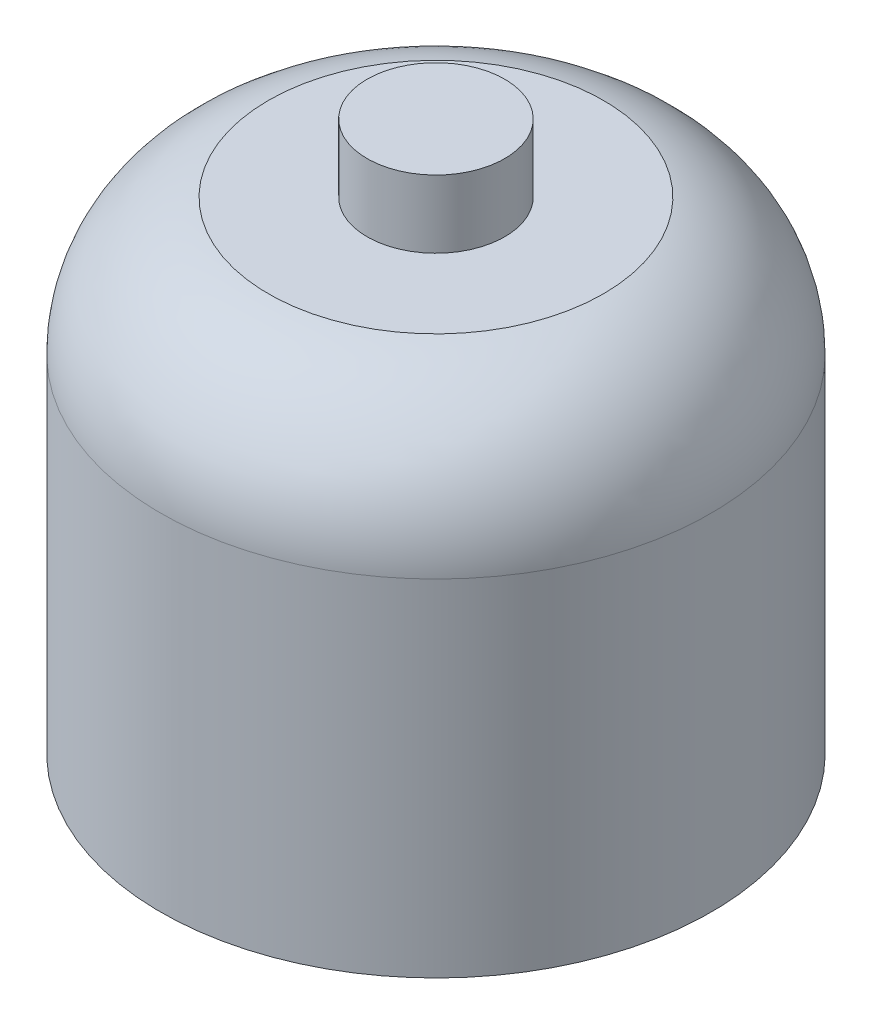
ISO-10303-21;
HEADER;
FILE_DESCRIPTION(('STEP AP214'),'2;1');
FILE_NAME('part.step','',(''),(''),'','','');
FILE_SCHEMA(('AUTOMOTIVE_DESIGN { 1 0 10303 214 1 1 1 1 }'));
ENDSEC;
DATA;
#1=APPLICATION_CONTEXT('core data for automotive mechanical design processes');
#2=APPLICATION_PROTOCOL_DEFINITION('international standard','automotive_design',2000,#1);
#3=PRODUCT_CONTEXT('',#1,'mechanical');
#4=PRODUCT('Part','Part','',(#3));
#5=PRODUCT_RELATED_PRODUCT_CATEGORY('part','',(#4));
#6=PRODUCT_DEFINITION_FORMATION('','',#4);
#7=PRODUCT_DEFINITION_CONTEXT('part definition',#1,'design');
#8=PRODUCT_DEFINITION('design','',#6,#7);
#9=PRODUCT_DEFINITION_SHAPE('','',#8);
#10=(LENGTH_UNIT() NAMED_UNIT(*) SI_UNIT(.MILLI.,.METRE.));
#11=(NAMED_UNIT(*) PLANE_ANGLE_UNIT() SI_UNIT($,.RADIAN.));
#12=(NAMED_UNIT(*) SI_UNIT($,.STERADIAN.) SOLID_ANGLE_UNIT());
#13=UNCERTAINTY_MEASURE_WITH_UNIT(LENGTH_MEASURE(1.E-05),#10,'distance_accuracy_value','');
#14=(GEOMETRIC_REPRESENTATION_CONTEXT(3) GLOBAL_UNCERTAINTY_ASSIGNED_CONTEXT((#13)) GLOBAL_UNIT_ASSIGNED_CONTEXT((#10,
#11,#12)) REPRESENTATION_CONTEXT('',''));
#15=CARTESIAN_POINT('',(0.,0.,0.));
#16=DIRECTION('',(0.,0.,1.));
#17=DIRECTION('',(1.,0.,0.));
#18=AXIS2_PLACEMENT_3D('',#15,#16,#17);
#19=CARTESIAN_POINT('',(-100.,364.980544747082,0.));
#20=DIRECTION('',(0.,1.,0.));
#21=DIRECTION('',(-1.,0.,0.));
#22=AXIS2_PLACEMENT_3D('',#19,#20,#21);
#23=PLANE('',#22);
#24=CARTESIAN_POINT('',(0.,364.980544747082,0.));
#25=DIRECTION('',(0.,1.,0.));
#26=DIRECTION('',(-1.,0.,0.));
#27=AXIS2_PLACEMENT_3D('',#24,#25,#26);
#28=CIRCLE('',#27,100.);
#29=CARTESIAN_POINT('',(-100.,364.980544747082,0.));
#30=VERTEX_POINT('',#29);
#31=EDGE_CURVE('E51',#30,#30,#28,.T.);
#32=ORIENTED_EDGE('',*,*,#31,.T.);
#33=EDGE_LOOP('',(#32));
#34=FACE_BOUND('',#33,.T.);
#35=ADVANCED_FACE('F32',(#34),#23,.T.);
#36=CARTESIAN_POINT('',(0.,-433.463035019455,0.));
#37=DIRECTION('',(0.,-1.,0.));
#38=DIRECTION('',(1.,0.,0.));
#39=AXIS2_PLACEMENT_3D('',#36,#37,#38);
#40=PLANE('',#39);
#41=CARTESIAN_POINT('',(0.,-433.463035019455,0.));
#42=DIRECTION('',(0.,-1.,0.));
#43=DIRECTION('',(1.,0.,0.));
#44=AXIS2_PLACEMENT_3D('',#41,#42,#43);
#45=CIRCLE('',#44,300.);
#46=CARTESIAN_POINT('',(300.,-433.463035019455,0.));
#47=VERTEX_POINT('',#46);
#48=EDGE_CURVE('E55',#47,#47,#45,.T.);
#49=ORIENTED_EDGE('',*,*,#48,.F.);
#50=EDGE_LOOP('',(#49));
#51=FACE_BOUND('',#50,.T.);
#52=CARTESIAN_POINT('',(0.,-433.463035019455,0.));
#53=DIRECTION('',(0.,1.,0.));
#54=DIRECTION('',(-1.,0.,0.));
#55=AXIS2_PLACEMENT_3D('',#52,#53,#54);
#56=CIRCLE('',#55,400.);
#57=CARTESIAN_POINT('',(-400.,-433.463035019455,0.));
#58=VERTEX_POINT('',#57);
#59=EDGE_CURVE('E10',#58,#58,#56,.T.);
#60=ORIENTED_EDGE('',*,*,#59,.F.);
#61=EDGE_LOOP('',(#60));
#62=FACE_BOUND('',#61,.T.);
#63=ADVANCED_FACE('F70',(#51,#62),#40,.T.);
#64=CARTESIAN_POINT('',(0.,266.536964980545,0.));
#65=DIRECTION('',(0.,1.,0.));
#66=DIRECTION('',(-1.,0.,0.));
#67=AXIS2_PLACEMENT_3D('',#64,#65,#66);
#68=CYLINDRICAL_SURFACE('',#67,400.);
#69=ORIENTED_EDGE('',*,*,#59,.T.);
#70=EDGE_LOOP('',(#69));
#71=FACE_BOUND('',#70,.T.);
#72=CARTESIAN_POINT('',(0.,68.6249777097032,0.));
#73=DIRECTION('',(0.,1.,0.));
#74=DIRECTION('',(-1.,0.,0.));
#75=AXIS2_PLACEMENT_3D('',#72,#73,#74);
#76=CIRCLE('',#75,400.);
#77=CARTESIAN_POINT('',(-400.,68.6249777097032,0.));
#78=VERTEX_POINT('',#77);
#79=EDGE_CURVE('E38',#78,#78,#76,.T.);
#80=ORIENTED_EDGE('',*,*,#79,.F.);
#81=EDGE_LOOP('',(#80));
#82=FACE_BOUND('',#81,.T.);
#83=ADVANCED_FACE('F73',(#71,#82),#68,.T.);
#84=CARTESIAN_POINT('',(0.,68.6249777097032,0.));
#85=DIRECTION('',(0.,1.,0.));
#86=DIRECTION('',(-1.,0.,0.));
#87=AXIS2_PLACEMENT_3D('',#84,#85,#86);
#88=DEGENERATE_TOROIDAL_SURFACE('',#87,196.611046082,203.388953918,.T.);
#89=ORIENTED_EDGE('',*,*,#79,.T.);
#90=EDGE_LOOP('',(#89));
#91=FACE_BOUND('',#90,.T.);
#92=CARTESIAN_POINT('',(0.,266.536964980545,0.));
#93=DIRECTION('',(0.,1.,0.));
#94=DIRECTION('',(-1.,0.,0.));
#95=AXIS2_PLACEMENT_3D('',#92,#93,#94);
#96=CIRCLE('',#95,243.492938859113);
#97=CARTESIAN_POINT('',(-243.492938859113,266.536964980545,0.));
#98=VERTEX_POINT('',#97);
#99=EDGE_CURVE('E42',#98,#98,#96,.T.);
#100=ORIENTED_EDGE('',*,*,#99,.F.);
#101=EDGE_LOOP('',(#100));
#102=FACE_BOUND('',#101,.T.);
#103=ADVANCED_FACE('F78',(#91,#102),#88,.T.);
#104=CARTESIAN_POINT('',(-243.492938859113,266.536964980545,0.));
#105=DIRECTION('',(0.,1.,0.));
#106=DIRECTION('',(-1.,0.,0.));
#107=AXIS2_PLACEMENT_3D('',#104,#105,#106);
#108=PLANE('',#107);
#109=ORIENTED_EDGE('',*,*,#99,.T.);
#110=EDGE_LOOP('',(#109));
#111=FACE_BOUND('',#110,.T.);
#112=CARTESIAN_POINT('',(0.,266.536964980545,0.));
#113=DIRECTION('',(0.,1.,0.));
#114=DIRECTION('',(-1.,0.,0.));
#115=AXIS2_PLACEMENT_3D('',#112,#113,#114);
#116=CIRCLE('',#115,100.);
#117=CARTESIAN_POINT('',(-100.,266.536964980545,0.));
#118=VERTEX_POINT('',#117);
#119=EDGE_CURVE('E46',#118,#118,#116,.T.);
#120=ORIENTED_EDGE('',*,*,#119,.F.);
#121=EDGE_LOOP('',(#120));
#122=FACE_BOUND('',#121,.T.);
#123=ADVANCED_FACE('F84',(#111,#122),#108,.T.);
#124=CARTESIAN_POINT('',(0.,266.536964980545,0.));
#125=DIRECTION('',(0.,1.,0.));
#126=DIRECTION('',(-1.,0.,0.));
#127=AXIS2_PLACEMENT_3D('',#124,#125,#126);
#128=CYLINDRICAL_SURFACE('',#127,100.);
#129=ORIENTED_EDGE('',*,*,#119,.T.);
#130=EDGE_LOOP('',(#129));
#131=FACE_BOUND('',#130,.T.);
#132=ORIENTED_EDGE('',*,*,#31,.F.);
#133=EDGE_LOOP('',(#132));
#134=FACE_BOUND('',#133,.T.);
#135=ADVANCED_FACE('F66',(#131,#134),#128,.T.);
#136=CARTESIAN_POINT('',(0.,-33.4630350194554,0.));
#137=DIRECTION('',(0.,-1.,0.));
#138=DIRECTION('',(1.,0.,0.));
#139=AXIS2_PLACEMENT_3D('',#136,#137,#138);
#140=CYLINDRICAL_SURFACE('',#139,300.);
#141=CARTESIAN_POINT('',(0.,-33.4630350194554,0.));
#142=DIRECTION('',(0.,-1.,0.));
#143=DIRECTION('',(1.,0.,0.));
#144=AXIS2_PLACEMENT_3D('',#141,#142,#143);
#145=CIRCLE('',#144,300.);
#146=CARTESIAN_POINT('',(300.,-33.4630350194553,0.));
#147=VERTEX_POINT('',#146);
#148=EDGE_CURVE('E54',#147,#147,#145,.T.);
#149=ORIENTED_EDGE('',*,*,#148,.F.);
#150=EDGE_LOOP('',(#149));
#151=FACE_BOUND('',#150,.T.);
#152=ORIENTED_EDGE('',*,*,#48,.T.);
#153=EDGE_LOOP('',(#152));
#154=FACE_BOUND('',#153,.T.);
#155=ADVANCED_FACE('F63',(#151,#154),#140,.F.);
#156=CARTESIAN_POINT('',(0.,-33.4630350194554,0.));
#157=DIRECTION('',(0.,-1.,0.));
#158=DIRECTION('',(1.,0.,0.));
#159=AXIS2_PLACEMENT_3D('',#156,#157,#158);
#160=PLANE('',#159);
#161=ORIENTED_EDGE('',*,*,#148,.T.);
#162=EDGE_LOOP('',(#161));
#163=FACE_BOUND('',#162,.T.);
#164=ADVANCED_FACE('F61',(#163),#160,.T.);
#165=CLOSED_SHELL('',(#35,#63,#83,#103,#123,#135,#155,#164));
#166=MANIFOLD_SOLID_BREP('B2',#165);
#167=ADVANCED_BREP_SHAPE_REPRESENTATION('',(#18,#166),#14);
#168=SHAPE_DEFINITION_REPRESENTATION(#9,#167);
ENDSEC;
END-ISO-10303-21;
